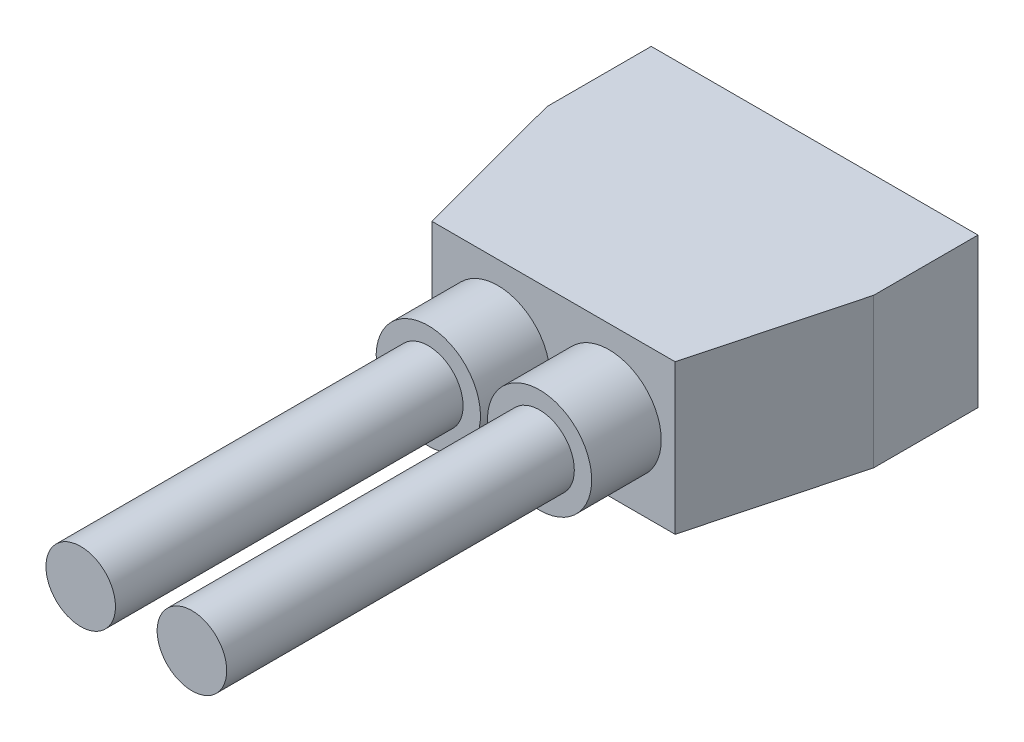
ISO-10303-21;
HEADER;
FILE_DESCRIPTION(('STEP AP214'),'2;1');
FILE_NAME('part.step','',(''),(''),'','','');
FILE_SCHEMA(('AUTOMOTIVE_DESIGN { 1 0 10303 214 1 1 1 1 }'));
ENDSEC;
DATA;
#1=APPLICATION_CONTEXT('core data for automotive mechanical design processes');
#2=APPLICATION_PROTOCOL_DEFINITION('international standard','automotive_design',2000,#1);
#3=PRODUCT_CONTEXT('',#1,'mechanical');
#4=PRODUCT('Part','Part','',(#3));
#5=PRODUCT_RELATED_PRODUCT_CATEGORY('part','',(#4));
#6=PRODUCT_DEFINITION_FORMATION('','',#4);
#7=PRODUCT_DEFINITION_CONTEXT('part definition',#1,'design');
#8=PRODUCT_DEFINITION('design','',#6,#7);
#9=PRODUCT_DEFINITION_SHAPE('','',#8);
#10=(LENGTH_UNIT() NAMED_UNIT(*) SI_UNIT(.MILLI.,.METRE.));
#11=(NAMED_UNIT(*) PLANE_ANGLE_UNIT() SI_UNIT($,.RADIAN.));
#12=(NAMED_UNIT(*) SI_UNIT($,.STERADIAN.) SOLID_ANGLE_UNIT());
#13=UNCERTAINTY_MEASURE_WITH_UNIT(LENGTH_MEASURE(1.E-05),#10,'distance_accuracy_value','');
#14=(GEOMETRIC_REPRESENTATION_CONTEXT(3) GLOBAL_UNCERTAINTY_ASSIGNED_CONTEXT((#13)) GLOBAL_UNIT_ASSIGNED_CONTEXT((#10,
#11,#12)) REPRESENTATION_CONTEXT('',''));
#15=CARTESIAN_POINT('',(0.,0.,0.));
#16=DIRECTION('',(0.,0.,1.));
#17=DIRECTION('',(1.,0.,0.));
#18=AXIS2_PLACEMENT_3D('',#15,#16,#17);
#19=CARTESIAN_POINT('',(-47.,21.5,30.));
#20=DIRECTION('',(1.,0.,0.));
#21=DIRECTION('',(0.,0.,-1.));
#22=AXIS2_PLACEMENT_3D('',#19,#20,#21);
#23=PLANE('',#22);
#24=DIRECTION('',(0.,-1.,0.));
#25=VECTOR('',#24,1.);
#26=CARTESIAN_POINT('',(-47.,21.5,0.));
#27=LINE('',#26,#25);
#28=CARTESIAN_POINT('',(-47.,21.5,0.));
#29=VERTEX_POINT('',#28);
#30=CARTESIAN_POINT('',(-47.,-21.5,0.));
#31=VERTEX_POINT('',#30);
#32=EDGE_CURVE('E116',#29,#31,#27,.T.);
#33=ORIENTED_EDGE('',*,*,#32,.T.);
#34=DIRECTION('',(0.,0.,-1.));
#35=VECTOR('',#34,1.);
#36=CARTESIAN_POINT('',(-47.,-21.5,30.));
#37=LINE('',#36,#35);
#38=CARTESIAN_POINT('',(-47.,-21.5,30.));
#39=VERTEX_POINT('',#38);
#40=EDGE_CURVE('E62',#39,#31,#37,.T.);
#41=ORIENTED_EDGE('',*,*,#40,.F.);
#42=DIRECTION('',(0.,-1.,0.));
#43=VECTOR('',#42,1.);
#44=CARTESIAN_POINT('',(-47.,21.5,30.));
#45=LINE('',#44,#43);
#46=CARTESIAN_POINT('',(-47.,21.5,30.));
#47=VERTEX_POINT('',#46);
#48=EDGE_CURVE('E77',#47,#39,#45,.T.);
#49=ORIENTED_EDGE('',*,*,#48,.F.);
#50=DIRECTION('',(0.,0.,-1.));
#51=VECTOR('',#50,1.);
#52=CARTESIAN_POINT('',(-47.,21.5,30.));
#53=LINE('',#52,#51);
#54=EDGE_CURVE('E78',#47,#29,#53,.T.);
#55=ORIENTED_EDGE('',*,*,#54,.T.);
#56=EDGE_LOOP('',(#33,#41,#49,#55));
#57=FACE_BOUND('',#56,.T.);
#58=ADVANCED_FACE('F17',(#57),#23,.F.);
#59=CARTESIAN_POINT('',(-47.,-21.5,30.));
#60=DIRECTION('',(0.,1.,0.));
#61=DIRECTION('',(0.,0.,1.));
#62=AXIS2_PLACEMENT_3D('',#59,#60,#61);
#63=PLANE('',#62);
#64=DIRECTION('',(1.,0.,0.));
#65=VECTOR('',#64,1.);
#66=CARTESIAN_POINT('',(-47.,-21.5,0.));
#67=LINE('',#66,#65);
#68=CARTESIAN_POINT('',(47.,-21.5,0.));
#69=VERTEX_POINT('',#68);
#70=EDGE_CURVE('E118',#31,#69,#67,.T.);
#71=ORIENTED_EDGE('',*,*,#70,.T.);
#72=DIRECTION('',(0.,0.,-1.));
#73=VECTOR('',#72,1.);
#74=CARTESIAN_POINT('',(47.,-21.5,30.));
#75=LINE('',#74,#73);
#76=CARTESIAN_POINT('',(47.,-21.5,30.));
#77=VERTEX_POINT('',#76);
#78=EDGE_CURVE('E128',#77,#69,#75,.T.);
#79=ORIENTED_EDGE('',*,*,#78,.F.);
#80=DIRECTION('',(-0.25697923884255,0.,0.966416923901845));
#81=VECTOR('',#80,1.);
#82=CARTESIAN_POINT('',(35.,-21.5,75.1281712057975));
#83=LINE('',#82,#81);
#84=CARTESIAN_POINT('',(35.,-21.5,75.1281712057975));
#85=VERTEX_POINT('',#84);
#86=EDGE_CURVE('E102',#77,#85,#83,.T.);
#87=ORIENTED_EDGE('',*,*,#86,.T.);
#88=DIRECTION('',(-1.,0.,0.));
#89=VECTOR('',#88,1.);
#90=CARTESIAN_POINT('',(35.,-21.5,75.1281712057975));
#91=LINE('',#90,#89);
#92=CARTESIAN_POINT('',(-35.,-21.5,75.1281712057975));
#93=VERTEX_POINT('',#92);
#94=EDGE_CURVE('E95',#85,#93,#91,.T.);
#95=ORIENTED_EDGE('',*,*,#94,.T.);
#96=DIRECTION('',(-0.25697923884255,0.,-0.966416923901845));
#97=VECTOR('',#96,1.);
#98=CARTESIAN_POINT('',(-35.,-21.5,75.1281712057975));
#99=LINE('',#98,#97);
#100=EDGE_CURVE('E108',#93,#39,#99,.T.);
#101=ORIENTED_EDGE('',*,*,#100,.T.);
#102=ORIENTED_EDGE('',*,*,#40,.T.);
#103=EDGE_LOOP('',(#71,#79,#87,#95,#101,#102));
#104=FACE_BOUND('',#103,.T.);
#105=ADVANCED_FACE('F147',(#104),#63,.F.);
#106=CARTESIAN_POINT('',(47.,-21.5,30.));
#107=DIRECTION('',(-1.,0.,0.));
#108=DIRECTION('',(0.,0.,1.));
#109=AXIS2_PLACEMENT_3D('',#106,#107,#108);
#110=PLANE('',#109);
#111=DIRECTION('',(0.,1.,0.));
#112=VECTOR('',#111,1.);
#113=CARTESIAN_POINT('',(47.,-21.5,0.));
#114=LINE('',#113,#112);
#115=CARTESIAN_POINT('',(47.,21.5,0.));
#116=VERTEX_POINT('',#115);
#117=EDGE_CURVE('E50',#69,#116,#114,.T.);
#118=ORIENTED_EDGE('',*,*,#117,.T.);
#119=DIRECTION('',(0.,0.,-1.));
#120=VECTOR('',#119,1.);
#121=CARTESIAN_POINT('',(47.,21.5,30.));
#122=LINE('',#121,#120);
#123=CARTESIAN_POINT('',(47.,21.5,30.));
#124=VERTEX_POINT('',#123);
#125=EDGE_CURVE('E34',#124,#116,#122,.T.);
#126=ORIENTED_EDGE('',*,*,#125,.F.);
#127=DIRECTION('',(0.,1.,0.));
#128=VECTOR('',#127,1.);
#129=CARTESIAN_POINT('',(47.,-21.5,30.));
#130=LINE('',#129,#128);
#131=EDGE_CURVE('E84',#77,#124,#130,.T.);
#132=ORIENTED_EDGE('',*,*,#131,.F.);
#133=ORIENTED_EDGE('',*,*,#78,.T.);
#134=EDGE_LOOP('',(#118,#126,#132,#133));
#135=FACE_BOUND('',#134,.T.);
#136=ADVANCED_FACE('F152',(#135),#110,.F.);
#137=CARTESIAN_POINT('',(47.,21.5,30.));
#138=DIRECTION('',(0.,-1.,0.));
#139=DIRECTION('',(0.,0.,-1.));
#140=AXIS2_PLACEMENT_3D('',#137,#138,#139);
#141=PLANE('',#140);
#142=DIRECTION('',(-1.,0.,0.));
#143=VECTOR('',#142,1.);
#144=CARTESIAN_POINT('',(47.,21.5,0.));
#145=LINE('',#144,#143);
#146=EDGE_CURVE('E55',#116,#29,#145,.T.);
#147=ORIENTED_EDGE('',*,*,#146,.T.);
#148=ORIENTED_EDGE('',*,*,#54,.F.);
#149=DIRECTION('',(-0.25697923884255,0.,-0.966416923901845));
#150=VECTOR('',#149,1.);
#151=CARTESIAN_POINT('',(-35.,21.5,75.1281712057975));
#152=LINE('',#151,#150);
#153=CARTESIAN_POINT('',(-35.,21.5,75.1281712057975));
#154=VERTEX_POINT('',#153);
#155=EDGE_CURVE('E89',#154,#47,#152,.T.);
#156=ORIENTED_EDGE('',*,*,#155,.F.);
#157=DIRECTION('',(-1.,0.,0.));
#158=VECTOR('',#157,1.);
#159=CARTESIAN_POINT('',(35.,21.5,75.1281712057975));
#160=LINE('',#159,#158);
#161=CARTESIAN_POINT('',(35.,21.5,75.1281712057975));
#162=VERTEX_POINT('',#161);
#163=EDGE_CURVE('E98',#162,#154,#160,.T.);
#164=ORIENTED_EDGE('',*,*,#163,.F.);
#165=DIRECTION('',(-0.25697923884255,0.,0.966416923901845));
#166=VECTOR('',#165,1.);
#167=CARTESIAN_POINT('',(35.,21.5,75.1281712057975));
#168=LINE('',#167,#166);
#169=EDGE_CURVE('E94',#124,#162,#168,.T.);
#170=ORIENTED_EDGE('',*,*,#169,.F.);
#171=ORIENTED_EDGE('',*,*,#125,.T.);
#172=EDGE_LOOP('',(#147,#148,#156,#164,#170,#171));
#173=FACE_BOUND('',#172,.T.);
#174=ADVANCED_FACE('F87',(#173),#141,.F.);
#175=CARTESIAN_POINT('',(0.,0.,0.));
#176=DIRECTION('',(0.,0.,1.));
#177=DIRECTION('',(1.,0.,0.));
#178=AXIS2_PLACEMENT_3D('',#175,#176,#177);
#179=PLANE('',#178);
#180=ORIENTED_EDGE('',*,*,#32,.F.);
#181=ORIENTED_EDGE('',*,*,#146,.F.);
#182=ORIENTED_EDGE('',*,*,#117,.F.);
#183=ORIENTED_EDGE('',*,*,#70,.F.);
#184=EDGE_LOOP('',(#180,#181,#182,#183));
#185=FACE_BOUND('',#184,.T.);
#186=ADVANCED_FACE('F151',(#185),#179,.F.);
#187=CARTESIAN_POINT('',(-35.,21.5,75.1281712057975));
#188=DIRECTION('',(-0.966416923901845,0.,0.25697923884255));
#189=DIRECTION('',(0.25697923884255,0.,0.966416923901845));
#190=AXIS2_PLACEMENT_3D('',#187,#188,#189);
#191=PLANE('',#190);
#192=ORIENTED_EDGE('',*,*,#100,.F.);
#193=DIRECTION('',(0.,-1.,0.));
#194=VECTOR('',#193,1.);
#195=CARTESIAN_POINT('',(-35.,21.5,75.1281712057975));
#196=LINE('',#195,#194);
#197=EDGE_CURVE('E92',#154,#93,#196,.T.);
#198=ORIENTED_EDGE('',*,*,#197,.F.);
#199=ORIENTED_EDGE('',*,*,#155,.T.);
#200=ORIENTED_EDGE('',*,*,#48,.T.);
#201=EDGE_LOOP('',(#192,#198,#199,#200));
#202=FACE_BOUND('',#201,.T.);
#203=ADVANCED_FACE('F91',(#202),#191,.T.);
#204=CARTESIAN_POINT('',(35.,21.5,75.1281712057975));
#205=DIRECTION('',(0.966416923901845,0.,0.25697923884255));
#206=DIRECTION('',(0.25697923884255,0.,-0.966416923901845));
#207=AXIS2_PLACEMENT_3D('',#204,#205,#206);
#208=PLANE('',#207);
#209=ORIENTED_EDGE('',*,*,#86,.F.);
#210=ORIENTED_EDGE('',*,*,#131,.T.);
#211=ORIENTED_EDGE('',*,*,#169,.T.);
#212=DIRECTION('',(0.,-1.,0.));
#213=VECTOR('',#212,1.);
#214=CARTESIAN_POINT('',(35.,21.5,75.1281712057975));
#215=LINE('',#214,#213);
#216=EDGE_CURVE('E114',#162,#85,#215,.T.);
#217=ORIENTED_EDGE('',*,*,#216,.T.);
#218=EDGE_LOOP('',(#209,#210,#211,#217));
#219=FACE_BOUND('',#218,.T.);
#220=ADVANCED_FACE('F141',(#219),#208,.T.);
#221=CARTESIAN_POINT('',(35.,21.5,75.1281712057975));
#222=DIRECTION('',(0.,0.,1.));
#223=DIRECTION('',(1.,0.,0.));
#224=AXIS2_PLACEMENT_3D('',#221,#222,#223);
#225=PLANE('',#224);
#226=CARTESIAN_POINT('',(16.,0.,75.1281712057975));
#227=DIRECTION('',(0.,0.,1.));
#228=DIRECTION('',(1.,0.,0.));
#229=AXIS2_PLACEMENT_3D('',#226,#227,#228);
#230=CIRCLE('',#229,15.);
#231=CARTESIAN_POINT('',(31.,0.,75.1281712057975));
#232=VERTEX_POINT('',#231);
#233=EDGE_CURVE('E11',#232,#232,#230,.T.);
#234=ORIENTED_EDGE('',*,*,#233,.F.);
#235=EDGE_LOOP('',(#234));
#236=FACE_BOUND('',#235,.T.);
#237=CARTESIAN_POINT('',(-16.,0.,75.1281712057975));
#238=DIRECTION('',(0.,0.,1.));
#239=DIRECTION('',(1.,0.,0.));
#240=AXIS2_PLACEMENT_3D('',#237,#238,#239);
#241=CIRCLE('',#240,15.);
#242=CARTESIAN_POINT('',(-1.,0.,75.1281712057975));
#243=VERTEX_POINT('',#242);
#244=EDGE_CURVE('E26',#243,#243,#241,.T.);
#245=ORIENTED_EDGE('',*,*,#244,.F.);
#246=EDGE_LOOP('',(#245));
#247=FACE_BOUND('',#246,.T.);
#248=ORIENTED_EDGE('',*,*,#94,.F.);
#249=ORIENTED_EDGE('',*,*,#216,.F.);
#250=ORIENTED_EDGE('',*,*,#163,.T.);
#251=ORIENTED_EDGE('',*,*,#197,.T.);
#252=EDGE_LOOP('',(#248,#249,#250,#251));
#253=FACE_BOUND('',#252,.T.);
#254=ADVANCED_FACE('F138',(#236,#247,#253),#225,.T.);
#255=CARTESIAN_POINT('',(-16.,0.,95.1281712057975));
#256=DIRECTION('',(0.,0.,-1.));
#257=DIRECTION('',(-1.,0.,0.));
#258=AXIS2_PLACEMENT_3D('',#255,#256,#257);
#259=CYLINDRICAL_SURFACE('',#258,15.);
#260=CARTESIAN_POINT('',(-16.,0.,95.1281712057975));
#261=DIRECTION('',(0.,0.,-1.));
#262=DIRECTION('',(0.,-1.,0.));
#263=AXIS2_PLACEMENT_3D('',#260,#261,#262);
#264=CIRCLE('',#263,15.);
#265=CARTESIAN_POINT('',(-16.,-15.,95.1281712057975));
#266=VERTEX_POINT('',#265);
#267=EDGE_CURVE('E112',#266,#266,#264,.T.);
#268=ORIENTED_EDGE('',*,*,#267,.T.);
#269=EDGE_LOOP('',(#268));
#270=FACE_BOUND('',#269,.T.);
#271=ORIENTED_EDGE('',*,*,#244,.T.);
#272=EDGE_LOOP('',(#271));
#273=FACE_BOUND('',#272,.T.);
#274=ADVANCED_FACE('F136',(#270,#273),#259,.T.);
#275=CARTESIAN_POINT('',(-16.,0.,95.1281712057975));
#276=DIRECTION('',(0.,0.,-1.));
#277=DIRECTION('',(-1.,0.,0.));
#278=AXIS2_PLACEMENT_3D('',#275,#276,#277);
#279=PLANE('',#278);
#280=CARTESIAN_POINT('',(-16.,0.,95.1281712057975));
#281=DIRECTION('',(0.,0.,-1.));
#282=DIRECTION('',(1.,0.,0.));
#283=AXIS2_PLACEMENT_3D('',#280,#281,#282);
#284=CIRCLE('',#283,10.);
#285=CARTESIAN_POINT('',(-6.,0.,95.1281712057975));
#286=VERTEX_POINT('',#285);
#287=EDGE_CURVE('E589',#286,#286,#284,.T.);
#288=ORIENTED_EDGE('',*,*,#287,.T.);
#289=EDGE_LOOP('',(#288));
#290=FACE_BOUND('',#289,.T.);
#291=ORIENTED_EDGE('',*,*,#267,.F.);
#292=EDGE_LOOP('',(#291));
#293=FACE_BOUND('',#292,.T.);
#294=ADVANCED_FACE('F239',(#290,#293),#279,.F.);
#295=CARTESIAN_POINT('',(16.,0.,95.1281712057975));
#296=DIRECTION('',(0.,0.,-1.));
#297=DIRECTION('',(-1.,0.,0.));
#298=AXIS2_PLACEMENT_3D('',#295,#296,#297);
#299=CYLINDRICAL_SURFACE('',#298,15.);
#300=CARTESIAN_POINT('',(16.,0.,95.1281712057975));
#301=DIRECTION('',(0.,0.,-1.));
#302=DIRECTION('',(0.,-1.,0.));
#303=AXIS2_PLACEMENT_3D('',#300,#301,#302);
#304=CIRCLE('',#303,15.);
#305=CARTESIAN_POINT('',(16.,-15.,95.1281712057975));
#306=VERTEX_POINT('',#305);
#307=EDGE_CURVE('E601',#306,#306,#304,.T.);
#308=ORIENTED_EDGE('',*,*,#307,.T.);
#309=EDGE_LOOP('',(#308));
#310=FACE_BOUND('',#309,.T.);
#311=ORIENTED_EDGE('',*,*,#233,.T.);
#312=EDGE_LOOP('',(#311));
#313=FACE_BOUND('',#312,.T.);
#314=ADVANCED_FACE('F251',(#310,#313),#299,.T.);
#315=CARTESIAN_POINT('',(16.,0.,95.1281712057975));
#316=DIRECTION('',(0.,0.,-1.));
#317=DIRECTION('',(-1.,0.,0.));
#318=AXIS2_PLACEMENT_3D('',#315,#316,#317);
#319=PLANE('',#318);
#320=CARTESIAN_POINT('',(16.,0.,95.1281712057975));
#321=DIRECTION('',(0.,0.,-1.));
#322=DIRECTION('',(1.,0.,0.));
#323=AXIS2_PLACEMENT_3D('',#320,#321,#322);
#324=CIRCLE('',#323,10.);
#325=CARTESIAN_POINT('',(26.,0.,95.1281712057975));
#326=VERTEX_POINT('',#325);
#327=EDGE_CURVE('E590',#326,#326,#324,.T.);
#328=ORIENTED_EDGE('',*,*,#327,.T.);
#329=EDGE_LOOP('',(#328));
#330=FACE_BOUND('',#329,.T.);
#331=ORIENTED_EDGE('',*,*,#307,.F.);
#332=EDGE_LOOP('',(#331));
#333=FACE_BOUND('',#332,.T.);
#334=ADVANCED_FACE('F264',(#330,#333),#319,.F.);
#335=CARTESIAN_POINT('',(-16.,0.,195.128171205798));
#336=DIRECTION('',(0.,0.,-1.));
#337=DIRECTION('',(-1.,0.,0.));
#338=AXIS2_PLACEMENT_3D('',#335,#336,#337);
#339=CYLINDRICAL_SURFACE('',#338,10.);
#340=CARTESIAN_POINT('',(-16.,0.,195.128171205798));
#341=DIRECTION('',(0.,0.,-1.));
#342=DIRECTION('',(1.,0.,0.));
#343=AXIS2_PLACEMENT_3D('',#340,#341,#342);
#344=CIRCLE('',#343,10.);
#345=CARTESIAN_POINT('',(-6.,0.,195.128171205798));
#346=VERTEX_POINT('',#345);
#347=EDGE_CURVE('E594',#346,#346,#344,.T.);
#348=ORIENTED_EDGE('',*,*,#347,.T.);
#349=EDGE_LOOP('',(#348));
#350=FACE_BOUND('',#349,.T.);
#351=ORIENTED_EDGE('',*,*,#287,.F.);
#352=EDGE_LOOP('',(#351));
#353=FACE_BOUND('',#352,.T.);
#354=ADVANCED_FACE('F276',(#350,#353),#339,.T.);
#355=CARTESIAN_POINT('',(-16.,0.,195.128171205798));
#356=DIRECTION('',(0.,0.,-1.));
#357=DIRECTION('',(-1.,0.,0.));
#358=AXIS2_PLACEMENT_3D('',#355,#356,#357);
#359=PLANE('',#358);
#360=ORIENTED_EDGE('',*,*,#347,.F.);
#361=EDGE_LOOP('',(#360));
#362=FACE_BOUND('',#361,.T.);
#363=ADVANCED_FACE('F288',(#362),#359,.F.);
#364=CARTESIAN_POINT('',(16.,0.,195.128171205798));
#365=DIRECTION('',(0.,0.,-1.));
#366=DIRECTION('',(-1.,0.,0.));
#367=AXIS2_PLACEMENT_3D('',#364,#365,#366);
#368=CYLINDRICAL_SURFACE('',#367,10.);
#369=CARTESIAN_POINT('',(16.,0.,195.128171205798));
#370=DIRECTION('',(0.,0.,-1.));
#371=DIRECTION('',(1.,0.,0.));
#372=AXIS2_PLACEMENT_3D('',#369,#370,#371);
#373=CIRCLE('',#372,10.);
#374=CARTESIAN_POINT('',(26.,0.,195.128171205798));
#375=VERTEX_POINT('',#374);
#376=EDGE_CURVE('E588',#375,#375,#373,.T.);
#377=ORIENTED_EDGE('',*,*,#376,.T.);
#378=EDGE_LOOP('',(#377));
#379=FACE_BOUND('',#378,.T.);
#380=ORIENTED_EDGE('',*,*,#327,.F.);
#381=EDGE_LOOP('',(#380));
#382=FACE_BOUND('',#381,.T.);
#383=ADVANCED_FACE('F303',(#379,#382),#368,.T.);
#384=CARTESIAN_POINT('',(16.,0.,195.128171205798));
#385=DIRECTION('',(0.,0.,-1.));
#386=DIRECTION('',(-1.,0.,0.));
#387=AXIS2_PLACEMENT_3D('',#384,#385,#386);
#388=PLANE('',#387);
#389=ORIENTED_EDGE('',*,*,#376,.F.);
#390=EDGE_LOOP('',(#389));
#391=FACE_BOUND('',#390,.T.);
#392=ADVANCED_FACE('F316',(#391),#388,.F.);
#393=CLOSED_SHELL('',(#58,#105,#136,#174,#186,#203,#220,#254,#274,#294,#314,#334,#354,#363,#383,#392));
#394=MANIFOLD_SOLID_BREP('B1',#393);
#395=ADVANCED_BREP_SHAPE_REPRESENTATION('',(#18,#394),#14);
#396=SHAPE_DEFINITION_REPRESENTATION(#9,#395);
ENDSEC;
END-ISO-10303-21;
